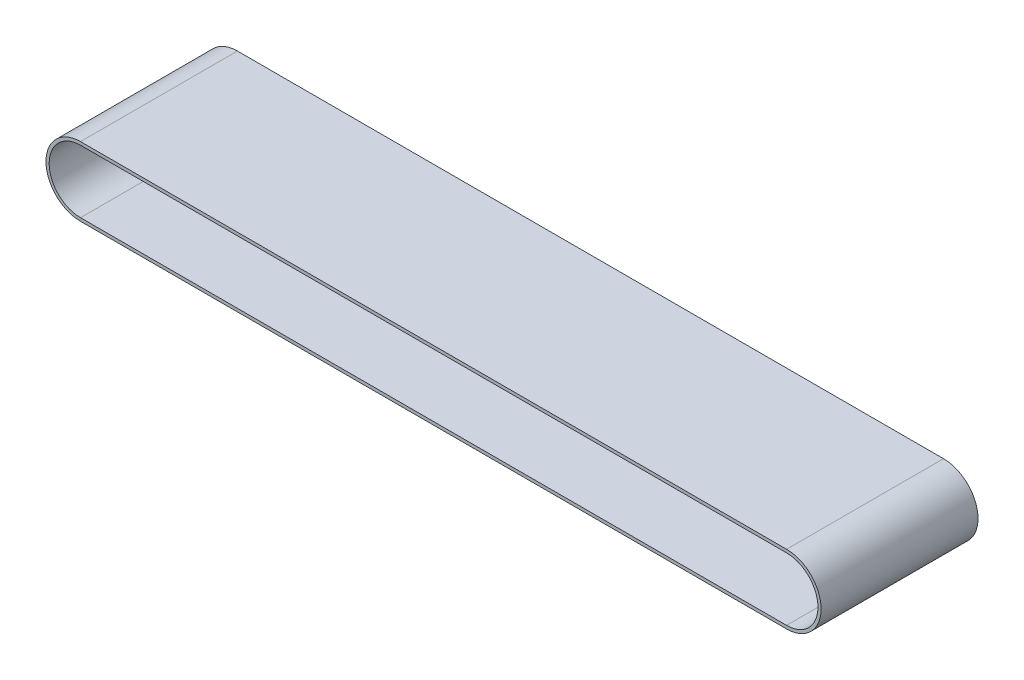
ISO-10303-21;
HEADER;
FILE_DESCRIPTION(('STEP AP214'),'2;1');
FILE_NAME('part.step','',(''),(''),'','','');
FILE_SCHEMA(('AUTOMOTIVE_DESIGN { 1 0 10303 214 1 1 1 1 }'));
ENDSEC;
DATA;
#1=APPLICATION_CONTEXT('core data for automotive mechanical design processes');
#2=APPLICATION_PROTOCOL_DEFINITION('international standard','automotive_design',2000,#1);
#3=PRODUCT_CONTEXT('',#1,'mechanical');
#4=PRODUCT('Part','Part','',(#3));
#5=PRODUCT_RELATED_PRODUCT_CATEGORY('part','',(#4));
#6=PRODUCT_DEFINITION_FORMATION('','',#4);
#7=PRODUCT_DEFINITION_CONTEXT('part definition',#1,'design');
#8=PRODUCT_DEFINITION('design','',#6,#7);
#9=PRODUCT_DEFINITION_SHAPE('','',#8);
#10=(LENGTH_UNIT() NAMED_UNIT(*) SI_UNIT(.MILLI.,.METRE.));
#11=(NAMED_UNIT(*) PLANE_ANGLE_UNIT() SI_UNIT($,.RADIAN.));
#12=(NAMED_UNIT(*) SI_UNIT($,.STERADIAN.) SOLID_ANGLE_UNIT());
#13=UNCERTAINTY_MEASURE_WITH_UNIT(LENGTH_MEASURE(1.E-05),#10,'distance_accuracy_value','');
#14=(GEOMETRIC_REPRESENTATION_CONTEXT(3) GLOBAL_UNCERTAINTY_ASSIGNED_CONTEXT((#13)) GLOBAL_UNIT_ASSIGNED_CONTEXT((#10,
#11,#12)) REPRESENTATION_CONTEXT('',''));
#15=CARTESIAN_POINT('',(0.,0.,0.));
#16=DIRECTION('',(0.,0.,1.));
#17=DIRECTION('',(1.,0.,0.));
#18=AXIS2_PLACEMENT_3D('',#15,#16,#17);
#19=CARTESIAN_POINT('',(-371.346770178647,-2.00000000000001,100.));
#20=DIRECTION('',(0.,0.,-1.));
#21=DIRECTION('',(-1.,0.,0.));
#22=AXIS2_PLACEMENT_3D('',#19,#20,#21);
#23=CYLINDRICAL_SURFACE('',#22,22.);
#24=CARTESIAN_POINT('',(-371.346770178647,-2.00000000000001,0.));
#25=DIRECTION('',(0.,0.,1.));
#26=DIRECTION('',(1.,0.,0.));
#27=AXIS2_PLACEMENT_3D('',#24,#25,#26);
#28=CIRCLE('',#27,22.);
#29=CARTESIAN_POINT('',(-371.346770178647,20.,0.));
#30=VERTEX_POINT('',#29);
#31=CARTESIAN_POINT('',(-371.346770178647,-24.,0.));
#32=VERTEX_POINT('',#31);
#33=EDGE_CURVE('E150',#30,#32,#28,.T.);
#34=ORIENTED_EDGE('',*,*,#33,.T.);
#35=DIRECTION('',(0.,0.,-1.));
#36=VECTOR('',#35,1.);
#37=CARTESIAN_POINT('',(-371.346770178647,-24.,100.));
#38=LINE('',#37,#36);
#39=CARTESIAN_POINT('',(-371.346770178647,-24.,100.));
#40=VERTEX_POINT('',#39);
#41=EDGE_CURVE('E11',#40,#32,#38,.T.);
#42=ORIENTED_EDGE('',*,*,#41,.F.);
#43=CARTESIAN_POINT('',(-371.346770178647,-2.00000000000001,100.));
#44=DIRECTION('',(0.,0.,1.));
#45=DIRECTION('',(1.,0.,0.));
#46=AXIS2_PLACEMENT_3D('',#43,#44,#45);
#47=CIRCLE('',#46,22.);
#48=CARTESIAN_POINT('',(-371.346770178647,20.,100.));
#49=VERTEX_POINT('',#48);
#50=EDGE_CURVE('E136',#49,#40,#47,.T.);
#51=ORIENTED_EDGE('',*,*,#50,.F.);
#52=DIRECTION('',(0.,0.,-1.));
#53=VECTOR('',#52,1.);
#54=CARTESIAN_POINT('',(-371.346770178647,20.,100.));
#55=LINE('',#54,#53);
#56=EDGE_CURVE('E148',#49,#30,#55,.T.);
#57=ORIENTED_EDGE('',*,*,#56,.T.);
#58=EDGE_LOOP('',(#34,#42,#51,#57));
#59=FACE_BOUND('',#58,.T.);
#60=ADVANCED_FACE('F39',(#59),#23,.T.);
#61=CARTESIAN_POINT('',(78.6532298213529,-24.,100.));
#62=DIRECTION('',(0.,1.,0.));
#63=DIRECTION('',(0.,0.,1.));
#64=AXIS2_PLACEMENT_3D('',#61,#62,#63);
#65=PLANE('',#64);
#66=DIRECTION('',(1.,0.,0.));
#67=VECTOR('',#66,1.);
#68=CARTESIAN_POINT('',(78.6532298213529,-24.,0.));
#69=LINE('',#68,#67);
#70=CARTESIAN_POINT('',(78.6532298213529,-24.,0.));
#71=VERTEX_POINT('',#70);
#72=EDGE_CURVE('E147',#32,#71,#69,.T.);
#73=ORIENTED_EDGE('',*,*,#72,.T.);
#74=DIRECTION('',(0.,0.,-1.));
#75=VECTOR('',#74,1.);
#76=CARTESIAN_POINT('',(78.6532298213529,-24.,100.));
#77=LINE('',#76,#75);
#78=CARTESIAN_POINT('',(78.6532298213529,-24.,100.));
#79=VERTEX_POINT('',#78);
#80=EDGE_CURVE('E46',#79,#71,#77,.T.);
#81=ORIENTED_EDGE('',*,*,#80,.F.);
#82=DIRECTION('',(1.,0.,0.));
#83=VECTOR('',#82,1.);
#84=CARTESIAN_POINT('',(78.6532298213529,-24.,100.));
#85=LINE('',#84,#83);
#86=EDGE_CURVE('E137',#40,#79,#85,.T.);
#87=ORIENTED_EDGE('',*,*,#86,.F.);
#88=ORIENTED_EDGE('',*,*,#41,.T.);
#89=EDGE_LOOP('',(#73,#81,#87,#88));
#90=FACE_BOUND('',#89,.T.);
#91=ADVANCED_FACE('F178',(#90),#65,.F.);
#92=CARTESIAN_POINT('',(78.6532298213529,-2.00000000000001,100.));
#93=DIRECTION('',(0.,0.,-1.));
#94=DIRECTION('',(-1.,0.,0.));
#95=AXIS2_PLACEMENT_3D('',#92,#93,#94);
#96=CYLINDRICAL_SURFACE('',#95,22.);
#97=CARTESIAN_POINT('',(78.6532298213529,-2.00000000000001,0.));
#98=DIRECTION('',(0.,0.,1.));
#99=DIRECTION('',(1.,0.,0.));
#100=AXIS2_PLACEMENT_3D('',#97,#98,#99);
#101=CIRCLE('',#100,22.);
#102=CARTESIAN_POINT('',(78.6532298213529,20.,0.));
#103=VERTEX_POINT('',#102);
#104=EDGE_CURVE('E155',#71,#103,#101,.T.);
#105=ORIENTED_EDGE('',*,*,#104,.T.);
#106=DIRECTION('',(0.,0.,-1.));
#107=VECTOR('',#106,1.);
#108=CARTESIAN_POINT('',(78.6532298213529,20.,100.));
#109=LINE('',#108,#107);
#110=CARTESIAN_POINT('',(78.6532298213529,20.,100.));
#111=VERTEX_POINT('',#110);
#112=EDGE_CURVE('E160',#111,#103,#109,.T.);
#113=ORIENTED_EDGE('',*,*,#112,.F.);
#114=CARTESIAN_POINT('',(78.6532298213529,-2.00000000000001,100.));
#115=DIRECTION('',(0.,0.,1.));
#116=DIRECTION('',(1.,0.,0.));
#117=AXIS2_PLACEMENT_3D('',#114,#115,#116);
#118=CIRCLE('',#117,22.);
#119=EDGE_CURVE('E142',#79,#111,#118,.T.);
#120=ORIENTED_EDGE('',*,*,#119,.F.);
#121=ORIENTED_EDGE('',*,*,#80,.T.);
#122=EDGE_LOOP('',(#105,#113,#120,#121));
#123=FACE_BOUND('',#122,.T.);
#124=ADVANCED_FACE('F163',(#123),#96,.T.);
#125=CARTESIAN_POINT('',(-371.346770178647,20.,100.));
#126=DIRECTION('',(0.,-1.,0.));
#127=DIRECTION('',(1.,0.,0.));
#128=AXIS2_PLACEMENT_3D('',#125,#126,#127);
#129=PLANE('',#128);
#130=DIRECTION('',(-1.,0.,0.));
#131=VECTOR('',#130,1.);
#132=CARTESIAN_POINT('',(-371.346770178647,20.,0.));
#133=LINE('',#132,#131);
#134=EDGE_CURVE('E139',#103,#30,#133,.T.);
#135=ORIENTED_EDGE('',*,*,#134,.T.);
#136=ORIENTED_EDGE('',*,*,#56,.F.);
#137=DIRECTION('',(-1.,0.,0.));
#138=VECTOR('',#137,1.);
#139=CARTESIAN_POINT('',(-371.346770178647,20.,100.));
#140=LINE('',#139,#138);
#141=EDGE_CURVE('E145',#111,#49,#140,.T.);
#142=ORIENTED_EDGE('',*,*,#141,.F.);
#143=ORIENTED_EDGE('',*,*,#112,.T.);
#144=EDGE_LOOP('',(#135,#136,#142,#143));
#145=FACE_BOUND('',#144,.T.);
#146=ADVANCED_FACE('F174',(#145),#129,.F.);
#147=CARTESIAN_POINT('',(-371.346770178647,-2.00000000000001,100.));
#148=DIRECTION('',(0.,0.,1.));
#149=DIRECTION('',(1.,0.,0.));
#150=AXIS2_PLACEMENT_3D('',#147,#148,#149);
#151=PLANE('',#150);
#152=CARTESIAN_POINT('',(-371.346770178647,-2.00000000000001,100.));
#153=DIRECTION('',(0.,0.,1.));
#154=DIRECTION('',(1.,0.,0.));
#155=AXIS2_PLACEMENT_3D('',#152,#153,#154);
#156=CIRCLE('',#155,20.);
#157=CARTESIAN_POINT('',(-371.346770178647,18.,100.));
#158=VERTEX_POINT('',#157);
#159=CARTESIAN_POINT('',(-371.346770178647,-22.,100.));
#160=VERTEX_POINT('',#159);
#161=EDGE_CURVE('E122',#158,#160,#156,.T.);
#162=ORIENTED_EDGE('',*,*,#161,.F.);
#163=DIRECTION('',(-1.,0.,0.));
#164=VECTOR('',#163,1.);
#165=CARTESIAN_POINT('',(-371.346770178647,18.,100.));
#166=LINE('',#165,#164);
#167=CARTESIAN_POINT('',(78.6532298213529,18.,100.));
#168=VERTEX_POINT('',#167);
#169=EDGE_CURVE('E107',#168,#158,#166,.T.);
#170=ORIENTED_EDGE('',*,*,#169,.F.);
#171=CARTESIAN_POINT('',(78.6532298213529,-2.00000000000001,100.));
#172=DIRECTION('',(0.,0.,1.));
#173=DIRECTION('',(1.,0.,0.));
#174=AXIS2_PLACEMENT_3D('',#171,#172,#173);
#175=CIRCLE('',#174,20.);
#176=CARTESIAN_POINT('',(78.6532298213529,-22.,100.));
#177=VERTEX_POINT('',#176);
#178=EDGE_CURVE('E135',#177,#168,#175,.T.);
#179=ORIENTED_EDGE('',*,*,#178,.F.);
#180=DIRECTION('',(1.,0.,0.));
#181=VECTOR('',#180,1.);
#182=CARTESIAN_POINT('',(78.6532298213529,-22.,100.));
#183=LINE('',#182,#181);
#184=EDGE_CURVE('E127',#160,#177,#183,.T.);
#185=ORIENTED_EDGE('',*,*,#184,.F.);
#186=EDGE_LOOP('',(#162,#170,#179,#185));
#187=FACE_BOUND('',#186,.T.);
#188=ORIENTED_EDGE('',*,*,#50,.T.);
#189=ORIENTED_EDGE('',*,*,#86,.T.);
#190=ORIENTED_EDGE('',*,*,#119,.T.);
#191=ORIENTED_EDGE('',*,*,#141,.T.);
#192=EDGE_LOOP('',(#188,#189,#190,#191));
#193=FACE_BOUND('',#192,.T.);
#194=ADVANCED_FACE('F180',(#187,#193),#151,.T.);
#195=CARTESIAN_POINT('',(-371.346770178647,-2.00000000000001,0.));
#196=DIRECTION('',(0.,0.,1.));
#197=DIRECTION('',(1.,0.,0.));
#198=AXIS2_PLACEMENT_3D('',#195,#196,#197);
#199=PLANE('',#198);
#200=DIRECTION('',(-1.,0.,0.));
#201=VECTOR('',#200,1.);
#202=CARTESIAN_POINT('',(-371.346770178647,18.,0.));
#203=LINE('',#202,#201);
#204=CARTESIAN_POINT('',(78.6532298213529,18.,0.));
#205=VERTEX_POINT('',#204);
#206=CARTESIAN_POINT('',(-371.346770178647,18.,0.));
#207=VERTEX_POINT('',#206);
#208=EDGE_CURVE('E106',#205,#207,#203,.T.);
#209=ORIENTED_EDGE('',*,*,#208,.T.);
#210=CARTESIAN_POINT('',(-371.346770178647,-2.00000000000001,0.));
#211=DIRECTION('',(0.,0.,1.));
#212=DIRECTION('',(1.,0.,0.));
#213=AXIS2_PLACEMENT_3D('',#210,#211,#212);
#214=CIRCLE('',#213,20.);
#215=CARTESIAN_POINT('',(-371.346770178647,-22.,0.));
#216=VERTEX_POINT('',#215);
#217=EDGE_CURVE('E111',#207,#216,#214,.T.);
#218=ORIENTED_EDGE('',*,*,#217,.T.);
#219=DIRECTION('',(1.,0.,0.));
#220=VECTOR('',#219,1.);
#221=CARTESIAN_POINT('',(78.6532298213529,-22.,0.));
#222=LINE('',#221,#220);
#223=CARTESIAN_POINT('',(78.6532298213529,-22.,0.));
#224=VERTEX_POINT('',#223);
#225=EDGE_CURVE('E117',#216,#224,#222,.T.);
#226=ORIENTED_EDGE('',*,*,#225,.T.);
#227=CARTESIAN_POINT('',(78.6532298213529,-2.00000000000001,0.));
#228=DIRECTION('',(0.,0.,1.));
#229=DIRECTION('',(1.,0.,0.));
#230=AXIS2_PLACEMENT_3D('',#227,#228,#229);
#231=CIRCLE('',#230,20.);
#232=EDGE_CURVE('E58',#224,#205,#231,.T.);
#233=ORIENTED_EDGE('',*,*,#232,.T.);
#234=EDGE_LOOP('',(#209,#218,#226,#233));
#235=FACE_BOUND('',#234,.T.);
#236=ORIENTED_EDGE('',*,*,#33,.F.);
#237=ORIENTED_EDGE('',*,*,#134,.F.);
#238=ORIENTED_EDGE('',*,*,#104,.F.);
#239=ORIENTED_EDGE('',*,*,#72,.F.);
#240=EDGE_LOOP('',(#236,#237,#238,#239));
#241=FACE_BOUND('',#240,.T.);
#242=ADVANCED_FACE('F125',(#235,#241),#199,.F.);
#243=CARTESIAN_POINT('',(-371.346770178647,-2.00000000000001,100.));
#244=DIRECTION('',(0.,0.,-1.));
#245=DIRECTION('',(-1.,0.,0.));
#246=AXIS2_PLACEMENT_3D('',#243,#244,#245);
#247=CYLINDRICAL_SURFACE('',#246,20.);
#248=ORIENTED_EDGE('',*,*,#217,.F.);
#249=DIRECTION('',(0.,0.,-1.));
#250=VECTOR('',#249,1.);
#251=CARTESIAN_POINT('',(-371.346770178647,18.,100.));
#252=LINE('',#251,#250);
#253=EDGE_CURVE('E105',#158,#207,#252,.T.);
#254=ORIENTED_EDGE('',*,*,#253,.F.);
#255=ORIENTED_EDGE('',*,*,#161,.T.);
#256=DIRECTION('',(0.,0.,1.));
#257=VECTOR('',#256,1.);
#258=CARTESIAN_POINT('',(-371.346770178647,-22.,100.));
#259=LINE('',#258,#257);
#260=EDGE_CURVE('E116',#160,#216,#259,.F.);
#261=ORIENTED_EDGE('',*,*,#260,.T.);
#262=EDGE_LOOP('',(#248,#254,#255,#261));
#263=FACE_BOUND('',#262,.T.);
#264=ADVANCED_FACE('F113',(#263),#247,.F.);
#265=CARTESIAN_POINT('',(78.6532298213529,-22.,100.));
#266=DIRECTION('',(0.,1.,0.));
#267=DIRECTION('',(0.,0.,1.));
#268=AXIS2_PLACEMENT_3D('',#265,#266,#267);
#269=PLANE('',#268);
#270=ORIENTED_EDGE('',*,*,#225,.F.);
#271=ORIENTED_EDGE('',*,*,#260,.F.);
#272=ORIENTED_EDGE('',*,*,#184,.T.);
#273=DIRECTION('',(0.,0.,-1.));
#274=VECTOR('',#273,1.);
#275=CARTESIAN_POINT('',(78.6532298213529,-22.,100.));
#276=LINE('',#275,#274);
#277=EDGE_CURVE('E265',#177,#224,#276,.T.);
#278=ORIENTED_EDGE('',*,*,#277,.T.);
#279=EDGE_LOOP('',(#270,#271,#272,#278));
#280=FACE_BOUND('',#279,.T.);
#281=ADVANCED_FACE('F196',(#280),#269,.T.);
#282=CARTESIAN_POINT('',(78.6532298213529,-2.00000000000001,100.));
#283=DIRECTION('',(0.,0.,-1.));
#284=DIRECTION('',(-1.,0.,0.));
#285=AXIS2_PLACEMENT_3D('',#282,#283,#284);
#286=CYLINDRICAL_SURFACE('',#285,20.);
#287=ORIENTED_EDGE('',*,*,#232,.F.);
#288=ORIENTED_EDGE('',*,*,#277,.F.);
#289=ORIENTED_EDGE('',*,*,#178,.T.);
#290=DIRECTION('',(0.,0.,1.));
#291=VECTOR('',#290,1.);
#292=CARTESIAN_POINT('',(78.6532298213529,18.,100.));
#293=LINE('',#292,#291);
#294=EDGE_CURVE('E52',#168,#205,#293,.F.);
#295=ORIENTED_EDGE('',*,*,#294,.T.);
#296=EDGE_LOOP('',(#287,#288,#289,#295));
#297=FACE_BOUND('',#296,.T.);
#298=ADVANCED_FACE('F194',(#297),#286,.F.);
#299=CARTESIAN_POINT('',(-371.346770178647,18.,100.));
#300=DIRECTION('',(0.,-1.,0.));
#301=DIRECTION('',(1.,0.,0.));
#302=AXIS2_PLACEMENT_3D('',#299,#300,#301);
#303=PLANE('',#302);
#304=ORIENTED_EDGE('',*,*,#208,.F.);
#305=ORIENTED_EDGE('',*,*,#294,.F.);
#306=ORIENTED_EDGE('',*,*,#169,.T.);
#307=ORIENTED_EDGE('',*,*,#253,.T.);
#308=EDGE_LOOP('',(#304,#305,#306,#307));
#309=FACE_BOUND('',#308,.T.);
#310=ADVANCED_FACE('F102',(#309),#303,.T.);
#311=CLOSED_SHELL('',(#60,#91,#124,#146,#194,#242,#264,#281,#298,#310));
#312=MANIFOLD_SOLID_BREP('B2',#311);
#313=ADVANCED_BREP_SHAPE_REPRESENTATION('',(#18,#312),#14);
#314=SHAPE_DEFINITION_REPRESENTATION(#9,#313);
ENDSEC;
END-ISO-10303-21;
